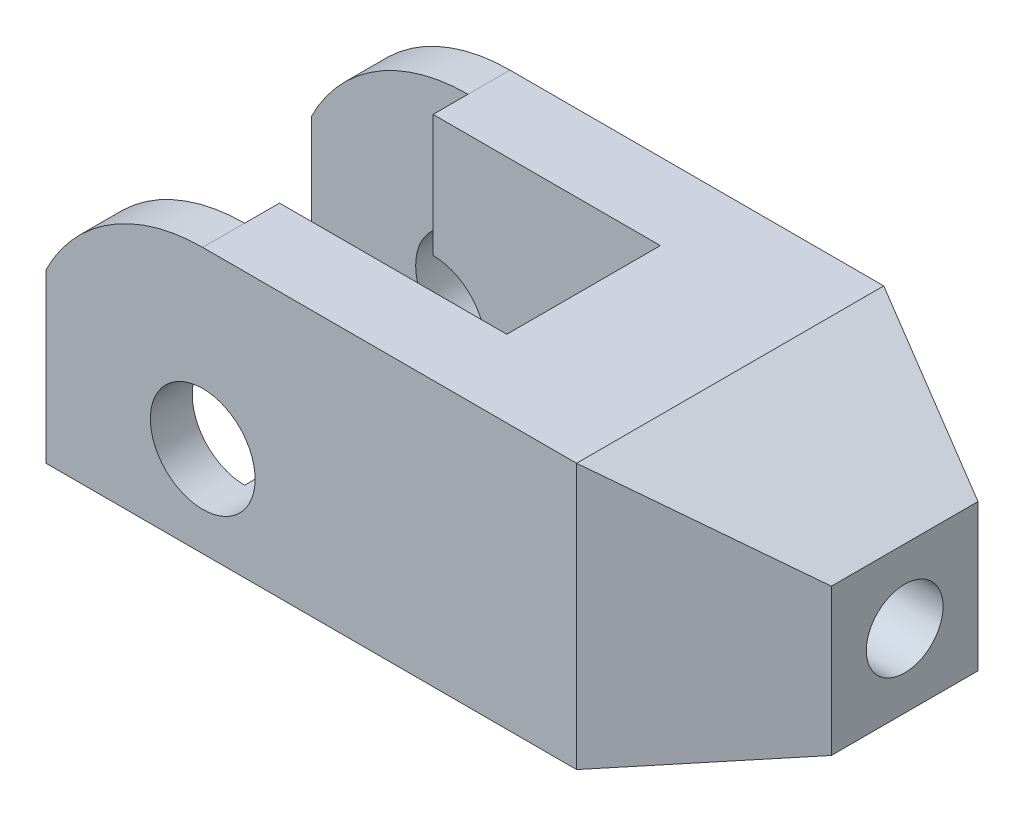
ISO-10303-21;
HEADER;
FILE_DESCRIPTION(('STEP AP214'),'2;1');
FILE_NAME('part.step','',(''),(''),'','','');
FILE_SCHEMA(('AUTOMOTIVE_DESIGN { 1 0 10303 214 1 1 1 1 }'));
ENDSEC;
DATA;
#1=APPLICATION_CONTEXT('core data for automotive mechanical design processes');
#2=APPLICATION_PROTOCOL_DEFINITION('international standard','automotive_design',2000,#1);
#3=PRODUCT_CONTEXT('',#1,'mechanical');
#4=PRODUCT('Part','Part','',(#3));
#5=PRODUCT_RELATED_PRODUCT_CATEGORY('part','',(#4));
#6=PRODUCT_DEFINITION_FORMATION('','',#4);
#7=PRODUCT_DEFINITION_CONTEXT('part definition',#1,'design');
#8=PRODUCT_DEFINITION('design','',#6,#7);
#9=PRODUCT_DEFINITION_SHAPE('','',#8);
#10=(LENGTH_UNIT() NAMED_UNIT(*) SI_UNIT(.MILLI.,.METRE.));
#11=(NAMED_UNIT(*) PLANE_ANGLE_UNIT() SI_UNIT($,.RADIAN.));
#12=(NAMED_UNIT(*) SI_UNIT($,.STERADIAN.) SOLID_ANGLE_UNIT());
#13=UNCERTAINTY_MEASURE_WITH_UNIT(LENGTH_MEASURE(1.E-05),#10,'distance_accuracy_value','');
#14=(GEOMETRIC_REPRESENTATION_CONTEXT(3) GLOBAL_UNCERTAINTY_ASSIGNED_CONTEXT((#13)) GLOBAL_UNIT_ASSIGNED_CONTEXT((#10,
#11,#12)) REPRESENTATION_CONTEXT('',''));
#15=CARTESIAN_POINT('',(0.,0.,0.));
#16=DIRECTION('',(0.,0.,1.));
#17=DIRECTION('',(1.,0.,0.));
#18=AXIS2_PLACEMENT_3D('',#15,#16,#17);
#19=CARTESIAN_POINT('',(0.,0.,22.));
#20=DIRECTION('',(1.,0.,0.));
#21=DIRECTION('',(0.,0.,-1.));
#22=AXIS2_PLACEMENT_3D('',#19,#20,#21);
#23=PLANE('',#22);
#24=DIRECTION('',(0.,-1.,0.));
#25=VECTOR('',#24,1.);
#26=CARTESIAN_POINT('',(0.,38.001,-16.));
#27=LINE('',#26,#25);
#28=CARTESIAN_POINT('',(0.,24.,-16.));
#29=VERTEX_POINT('',#28);
#30=CARTESIAN_POINT('',(0.,0.,-16.));
#31=VERTEX_POINT('',#30);
#32=EDGE_CURVE('E307',#29,#31,#27,.T.);
#33=ORIENTED_EDGE('',*,*,#32,.F.);
#34=DIRECTION('',(0.,0.,1.));
#35=VECTOR('',#34,1.);
#36=CARTESIAN_POINT('',(0.,24.,-22.));
#37=LINE('',#36,#35);
#38=CARTESIAN_POINT('',(0.,24.,-22.));
#39=VERTEX_POINT('',#38);
#40=EDGE_CURVE('E231',#39,#29,#37,.T.);
#41=ORIENTED_EDGE('',*,*,#40,.F.);
#42=DIRECTION('',(0.,-1.,0.));
#43=VECTOR('',#42,1.);
#44=CARTESIAN_POINT('',(0.,0.,-22.));
#45=LINE('',#44,#43);
#46=CARTESIAN_POINT('',(0.,0.,-22.));
#47=VERTEX_POINT('',#46);
#48=EDGE_CURVE('E217',#39,#47,#45,.T.);
#49=ORIENTED_EDGE('',*,*,#48,.T.);
#50=DIRECTION('',(0.,0.,-1.));
#51=VECTOR('',#50,1.);
#52=CARTESIAN_POINT('',(0.,0.,22.));
#53=LINE('',#52,#51);
#54=EDGE_CURVE('E47',#31,#47,#53,.T.);
#55=ORIENTED_EDGE('',*,*,#54,.F.);
#56=EDGE_LOOP('',(#33,#41,#49,#55));
#57=FACE_BOUND('',#56,.T.);
#58=ADVANCED_FACE('F41',(#57),#23,.F.);
#59=CARTESIAN_POINT('',(101.,0.,22.));
#60=DIRECTION('',(-1.,0.,0.));
#61=DIRECTION('',(0.,0.,1.));
#62=AXIS2_PLACEMENT_3D('',#59,#60,#61);
#63=PLANE('',#62);
#64=CARTESIAN_POINT('',(101.,19.,0.));
#65=DIRECTION('',(1.,0.,0.));
#66=DIRECTION('',(0.,0.,-1.));
#67=AXIS2_PLACEMENT_3D('',#64,#65,#66);
#68=CIRCLE('',#67,5.5);
#69=CARTESIAN_POINT('',(101.,19.,-5.5));
#70=VERTEX_POINT('',#69);
#71=EDGE_CURVE('E337',#70,#70,#68,.T.);
#72=ORIENTED_EDGE('',*,*,#71,.F.);
#73=EDGE_LOOP('',(#72));
#74=FACE_BOUND('',#73,.T.);
#75=DIRECTION('',(0.,0.,1.));
#76=VECTOR('',#75,1.);
#77=CARTESIAN_POINT('',(101.,29.5,-22.));
#78=LINE('',#77,#76);
#79=CARTESIAN_POINT('',(101.,29.5,-10.5));
#80=VERTEX_POINT('',#79);
#81=CARTESIAN_POINT('',(101.,29.5,10.5));
#82=VERTEX_POINT('',#81);
#83=EDGE_CURVE('E204',#80,#82,#78,.T.);
#84=ORIENTED_EDGE('',*,*,#83,.T.);
#85=DIRECTION('',(0.,-1.,0.));
#86=VECTOR('',#85,1.);
#87=CARTESIAN_POINT('',(101.,38.001,10.5));
#88=LINE('',#87,#86);
#89=CARTESIAN_POINT('',(101.,8.5,10.5));
#90=VERTEX_POINT('',#89);
#91=EDGE_CURVE('E180',#82,#90,#88,.T.);
#92=ORIENTED_EDGE('',*,*,#91,.T.);
#93=DIRECTION('',(0.,0.,1.));
#94=VECTOR('',#93,1.);
#95=CARTESIAN_POINT('',(101.,8.49999999999999,-22.));
#96=LINE('',#95,#94);
#97=CARTESIAN_POINT('',(101.,8.49999999999999,-10.5));
#98=VERTEX_POINT('',#97);
#99=EDGE_CURVE('E202',#98,#90,#96,.T.);
#100=ORIENTED_EDGE('',*,*,#99,.F.);
#101=DIRECTION('',(0.,-1.,0.));
#102=VECTOR('',#101,1.);
#103=CARTESIAN_POINT('',(101.,38.001,-10.5));
#104=LINE('',#103,#102);
#105=EDGE_CURVE('E57',#80,#98,#104,.T.);
#106=ORIENTED_EDGE('',*,*,#105,.F.);
#107=EDGE_LOOP('',(#84,#92,#100,#106));
#108=FACE_BOUND('',#107,.T.);
#109=ADVANCED_FACE('F350',(#74,#108),#63,.F.);
#110=CARTESIAN_POINT('',(0.,0.,22.));
#111=DIRECTION('',(0.,0.,-1.));
#112=DIRECTION('',(-1.,0.,0.));
#113=AXIS2_PLACEMENT_3D('',#110,#111,#112);
#114=PLANE('',#113);
#115=CARTESIAN_POINT('',(22.4499443206436,13.,22.));
#116=DIRECTION('',(0.,0.,1.));
#117=DIRECTION('',(1.,0.,0.));
#118=AXIS2_PLACEMENT_3D('',#115,#116,#117);
#119=CIRCLE('',#118,7.5);
#120=CARTESIAN_POINT('',(29.9499443206436,13.,22.));
#121=VERTEX_POINT('',#120);
#122=EDGE_CURVE('E238',#121,#121,#119,.T.);
#123=ORIENTED_EDGE('',*,*,#122,.F.);
#124=EDGE_LOOP('',(#123));
#125=FACE_BOUND('',#124,.T.);
#126=DIRECTION('',(0.,-1.,0.));
#127=VECTOR('',#126,1.);
#128=CARTESIAN_POINT('',(76.,38.001,22.));
#129=LINE('',#128,#127);
#130=CARTESIAN_POINT('',(76.,38.,22.));
#131=VERTEX_POINT('',#130);
#132=CARTESIAN_POINT('',(76.,0.,22.));
#133=VERTEX_POINT('',#132);
#134=EDGE_CURVE('E172',#131,#133,#129,.T.);
#135=ORIENTED_EDGE('',*,*,#134,.F.);
#136=DIRECTION('',(-1.,0.,0.));
#137=VECTOR('',#136,1.);
#138=CARTESIAN_POINT('',(0.,38.,22.));
#139=LINE('',#138,#137);
#140=CARTESIAN_POINT('',(22.4499443206436,38.,22.));
#141=VERTEX_POINT('',#140);
#142=EDGE_CURVE('E188',#131,#141,#139,.T.);
#143=ORIENTED_EDGE('',*,*,#142,.T.);
#144=CARTESIAN_POINT('',(22.4499443206436,13.,22.));
#145=DIRECTION('',(0.,0.,-1.));
#146=DIRECTION('',(1.,0.,0.));
#147=AXIS2_PLACEMENT_3D('',#144,#145,#146);
#148=CIRCLE('',#147,25.);
#149=CARTESIAN_POINT('',(0.,24.,22.));
#150=VERTEX_POINT('',#149);
#151=EDGE_CURVE('E228',#150,#141,#148,.T.);
#152=ORIENTED_EDGE('',*,*,#151,.F.);
#153=DIRECTION('',(0.,-1.,0.));
#154=VECTOR('',#153,1.);
#155=CARTESIAN_POINT('',(0.,0.,22.));
#156=LINE('',#155,#154);
#157=CARTESIAN_POINT('',(0.,0.,22.));
#158=VERTEX_POINT('',#157);
#159=EDGE_CURVE('E214',#150,#158,#156,.T.);
#160=ORIENTED_EDGE('',*,*,#159,.T.);
#161=DIRECTION('',(1.,0.,0.));
#162=VECTOR('',#161,1.);
#163=CARTESIAN_POINT('',(0.,0.,22.));
#164=LINE('',#163,#162);
#165=EDGE_CURVE('E194',#158,#133,#164,.T.);
#166=ORIENTED_EDGE('',*,*,#165,.T.);
#167=EDGE_LOOP('',(#135,#143,#152,#160,#166));
#168=FACE_BOUND('',#167,.T.);
#169=ADVANCED_FACE('F190',(#125,#168),#114,.F.);
#170=CARTESIAN_POINT('',(0.,0.,-22.));
#171=DIRECTION('',(0.,0.,-1.));
#172=DIRECTION('',(-1.,0.,0.));
#173=AXIS2_PLACEMENT_3D('',#170,#171,#172);
#174=PLANE('',#173);
#175=CARTESIAN_POINT('',(22.4499443206436,13.,-22.));
#176=DIRECTION('',(0.,0.,1.));
#177=DIRECTION('',(1.,0.,0.));
#178=AXIS2_PLACEMENT_3D('',#175,#176,#177);
#179=CIRCLE('',#178,7.5);
#180=CARTESIAN_POINT('',(29.9499443206436,13.,-22.));
#181=VERTEX_POINT('',#180);
#182=EDGE_CURVE('E226',#181,#181,#179,.T.);
#183=ORIENTED_EDGE('',*,*,#182,.T.);
#184=EDGE_LOOP('',(#183));
#185=FACE_BOUND('',#184,.T.);
#186=DIRECTION('',(-1.,0.,0.));
#187=VECTOR('',#186,1.);
#188=CARTESIAN_POINT('',(0.,38.,-22.));
#189=LINE('',#188,#187);
#190=CARTESIAN_POINT('',(76.,38.,-22.));
#191=VERTEX_POINT('',#190);
#192=CARTESIAN_POINT('',(22.4499443206436,38.,-22.));
#193=VERTEX_POINT('',#192);
#194=EDGE_CURVE('E223',#191,#193,#189,.T.);
#195=ORIENTED_EDGE('',*,*,#194,.F.);
#196=DIRECTION('',(0.,-1.,0.));
#197=VECTOR('',#196,1.);
#198=CARTESIAN_POINT('',(76.,38.001,-22.));
#199=LINE('',#198,#197);
#200=CARTESIAN_POINT('',(76.0000000000001,0.,-22.));
#201=VERTEX_POINT('',#200);
#202=EDGE_CURVE('E247',#191,#201,#199,.T.);
#203=ORIENTED_EDGE('',*,*,#202,.T.);
#204=DIRECTION('',(1.,0.,0.));
#205=VECTOR('',#204,1.);
#206=CARTESIAN_POINT('',(0.,0.,-22.));
#207=LINE('',#206,#205);
#208=EDGE_CURVE('E219',#47,#201,#207,.T.);
#209=ORIENTED_EDGE('',*,*,#208,.F.);
#210=ORIENTED_EDGE('',*,*,#48,.F.);
#211=CARTESIAN_POINT('',(22.4499443206436,13.,-22.));
#212=DIRECTION('',(0.,0.,-1.));
#213=DIRECTION('',(1.,0.,0.));
#214=AXIS2_PLACEMENT_3D('',#211,#212,#213);
#215=CIRCLE('',#214,25.);
#216=EDGE_CURVE('E230',#39,#193,#215,.T.);
#217=ORIENTED_EDGE('',*,*,#216,.T.);
#218=EDGE_LOOP('',(#195,#203,#209,#210,#217));
#219=FACE_BOUND('',#218,.T.);
#220=ADVANCED_FACE('F356',(#185,#219),#174,.T.);
#221=CARTESIAN_POINT('',(22.4499443206436,13.,-22.));
#222=DIRECTION('',(0.,0.,1.));
#223=DIRECTION('',(1.,0.,0.));
#224=AXIS2_PLACEMENT_3D('',#221,#222,#223);
#225=CYLINDRICAL_SURFACE('',#224,7.5);
#226=ORIENTED_EDGE('',*,*,#122,.T.);
#227=EDGE_LOOP('',(#226));
#228=FACE_BOUND('',#227,.T.);
#229=CARTESIAN_POINT('',(22.4499443206436,13.,16.));
#230=DIRECTION('',(0.,0.,-1.));
#231=DIRECTION('',(-1.,0.,0.));
#232=AXIS2_PLACEMENT_3D('',#229,#230,#231);
#233=CIRCLE('',#232,7.5);
#234=CARTESIAN_POINT('',(22.4499443206436,5.5,16.));
#235=VERTEX_POINT('',#234);
#236=CARTESIAN_POINT('',(22.4499443206436,20.5,16.));
#237=VERTEX_POINT('',#236);
#238=EDGE_CURVE('E280',#235,#237,#233,.T.);
#239=ORIENTED_EDGE('',*,*,#238,.T.);
#240=DIRECTION('',(0.,0.,1.));
#241=VECTOR('',#240,1.);
#242=CARTESIAN_POINT('',(22.4499443206436,20.5,-22.));
#243=LINE('',#242,#241);
#244=CARTESIAN_POINT('',(22.4499443206436,20.5,11.));
#245=VERTEX_POINT('',#244);
#246=EDGE_CURVE('E271',#237,#245,#243,.F.);
#247=ORIENTED_EDGE('',*,*,#246,.T.);
#248=CARTESIAN_POINT('',(22.4499443206436,13.,11.));
#249=DIRECTION('',(0.,0.,-1.));
#250=DIRECTION('',(-1.,0.,0.));
#251=AXIS2_PLACEMENT_3D('',#248,#249,#250);
#252=CIRCLE('',#251,7.5);
#253=CARTESIAN_POINT('',(22.4499443206436,5.5,11.));
#254=VERTEX_POINT('',#253);
#255=EDGE_CURVE('E266',#245,#254,#252,.T.);
#256=ORIENTED_EDGE('',*,*,#255,.T.);
#257=DIRECTION('',(0.,0.,1.));
#258=VECTOR('',#257,1.);
#259=CARTESIAN_POINT('',(22.4499443206436,5.5,-22.));
#260=LINE('',#259,#258);
#261=EDGE_CURVE('E278',#254,#235,#260,.T.);
#262=ORIENTED_EDGE('',*,*,#261,.T.);
#263=EDGE_LOOP('',(#239,#247,#256,#262));
#264=FACE_BOUND('',#263,.T.);
#265=ADVANCED_FACE('F401',(#228,#264),#225,.F.);
#266=ORIENTED_EDGE('',*,*,#182,.F.);
#267=EDGE_LOOP('',(#266));
#268=FACE_BOUND('',#267,.T.);
#269=CARTESIAN_POINT('',(22.4499443206436,13.,-11.));
#270=DIRECTION('',(0.,0.,1.));
#271=DIRECTION('',(1.,0.,0.));
#272=AXIS2_PLACEMENT_3D('',#269,#270,#271);
#273=CIRCLE('',#272,7.5);
#274=CARTESIAN_POINT('',(22.4499443206437,5.5,-11.));
#275=VERTEX_POINT('',#274);
#276=CARTESIAN_POINT('',(22.4499443206437,20.5,-11.));
#277=VERTEX_POINT('',#276);
#278=EDGE_CURVE('E269',#275,#277,#273,.T.);
#279=ORIENTED_EDGE('',*,*,#278,.T.);
#280=DIRECTION('',(0.,0.,1.));
#281=VECTOR('',#280,1.);
#282=CARTESIAN_POINT('',(22.4499443206437,20.5,-22.));
#283=LINE('',#282,#281);
#284=CARTESIAN_POINT('',(22.4499443206437,20.5,-16.));
#285=VERTEX_POINT('',#284);
#286=EDGE_CURVE('E262',#277,#285,#283,.F.);
#287=ORIENTED_EDGE('',*,*,#286,.T.);
#288=CARTESIAN_POINT('',(22.4499443206436,13.,-16.));
#289=DIRECTION('',(0.,0.,1.));
#290=DIRECTION('',(1.,0.,0.));
#291=AXIS2_PLACEMENT_3D('',#288,#289,#290);
#292=CIRCLE('',#291,7.5);
#293=CARTESIAN_POINT('',(22.4499443206437,5.5,-16.));
#294=VERTEX_POINT('',#293);
#295=EDGE_CURVE('E332',#285,#294,#292,.T.);
#296=ORIENTED_EDGE('',*,*,#295,.T.);
#297=DIRECTION('',(0.,0.,1.));
#298=VECTOR('',#297,1.);
#299=CARTESIAN_POINT('',(22.4499443206437,5.5,-22.));
#300=LINE('',#299,#298);
#301=EDGE_CURVE('E264',#294,#275,#300,.T.);
#302=ORIENTED_EDGE('',*,*,#301,.T.);
#303=EDGE_LOOP('',(#279,#287,#296,#302));
#304=FACE_BOUND('',#303,.T.);
#305=ADVANCED_FACE('F384',(#268,#304),#225,.F.);
#306=CARTESIAN_POINT('',(22.4499443206436,13.,-22.));
#307=DIRECTION('',(0.,0.,1.));
#308=DIRECTION('',(1.,0.,0.));
#309=AXIS2_PLACEMENT_3D('',#306,#307,#308);
#310=CYLINDRICAL_SURFACE('',#309,25.);
#311=DIRECTION('',(0.,0.,1.));
#312=VECTOR('',#311,1.);
#313=CARTESIAN_POINT('',(22.4499443206436,38.,-22.));
#314=LINE('',#313,#312);
#315=CARTESIAN_POINT('',(22.4499443206436,38.,16.));
#316=VERTEX_POINT('',#315);
#317=EDGE_CURVE('E209',#316,#141,#314,.T.);
#318=ORIENTED_EDGE('',*,*,#317,.F.);
#319=CARTESIAN_POINT('',(22.4499443206436,13.,16.));
#320=DIRECTION('',(0.,0.,-1.));
#321=DIRECTION('',(-1.,0.,0.));
#322=AXIS2_PLACEMENT_3D('',#319,#320,#321);
#323=CIRCLE('',#322,25.);
#324=CARTESIAN_POINT('',(0.,24.,16.));
#325=VERTEX_POINT('',#324);
#326=EDGE_CURVE('E257',#316,#325,#323,.F.);
#327=ORIENTED_EDGE('',*,*,#326,.T.);
#328=EDGE_CURVE('E236',#325,#150,#37,.T.);
#329=ORIENTED_EDGE('',*,*,#328,.T.);
#330=ORIENTED_EDGE('',*,*,#151,.T.);
#331=EDGE_LOOP('',(#318,#327,#329,#330));
#332=FACE_BOUND('',#331,.T.);
#333=ADVANCED_FACE('F413',(#332),#310,.T.);
#334=ORIENTED_EDGE('',*,*,#328,.F.);
#335=DIRECTION('',(0.,-1.,0.));
#336=VECTOR('',#335,1.);
#337=CARTESIAN_POINT('',(0.,38.001,16.));
#338=LINE('',#337,#336);
#339=CARTESIAN_POINT('',(0.,0.,16.));
#340=VERTEX_POINT('',#339);
#341=EDGE_CURVE('E330',#325,#340,#338,.T.);
#342=ORIENTED_EDGE('',*,*,#341,.T.);
#343=EDGE_CURVE('E11',#158,#340,#53,.T.);
#344=ORIENTED_EDGE('',*,*,#343,.F.);
#345=ORIENTED_EDGE('',*,*,#159,.F.);
#346=EDGE_LOOP('',(#334,#342,#344,#345));
#347=FACE_BOUND('',#346,.T.);
#348=ADVANCED_FACE('F43',(#347),#23,.F.);
#349=CARTESIAN_POINT('',(0.,38.,22.));
#350=DIRECTION('',(0.,-1.,0.));
#351=DIRECTION('',(0.,0.,-1.));
#352=AXIS2_PLACEMENT_3D('',#349,#350,#351);
#353=PLANE('',#352);
#354=DIRECTION('',(0.,0.,1.));
#355=VECTOR('',#354,1.);
#356=CARTESIAN_POINT('',(55.,38.,-11.));
#357=LINE('',#356,#355);
#358=CARTESIAN_POINT('',(55.,38.,-11.));
#359=VERTEX_POINT('',#358);
#360=CARTESIAN_POINT('',(55.,38.,11.));
#361=VERTEX_POINT('',#360);
#362=EDGE_CURVE('E281',#359,#361,#357,.T.);
#363=ORIENTED_EDGE('',*,*,#362,.T.);
#364=DIRECTION('',(-1.,0.,0.));
#365=VECTOR('',#364,1.);
#366=CARTESIAN_POINT('',(22.4499443206436,38.,11.));
#367=LINE('',#366,#365);
#368=CARTESIAN_POINT('',(22.4499443206436,38.,11.));
#369=VERTEX_POINT('',#368);
#370=EDGE_CURVE('E289',#361,#369,#367,.T.);
#371=ORIENTED_EDGE('',*,*,#370,.T.);
#372=DIRECTION('',(0.,0.,1.));
#373=VECTOR('',#372,1.);
#374=CARTESIAN_POINT('',(22.4499443206436,38.,-22.));
#375=LINE('',#374,#373);
#376=EDGE_CURVE('E253',#369,#316,#375,.T.);
#377=ORIENTED_EDGE('',*,*,#376,.T.);
#378=ORIENTED_EDGE('',*,*,#317,.T.);
#379=ORIENTED_EDGE('',*,*,#142,.F.);
#380=DIRECTION('',(0.,0.,1.));
#381=VECTOR('',#380,1.);
#382=CARTESIAN_POINT('',(76.,38.,-22.));
#383=LINE('',#382,#381);
#384=EDGE_CURVE('E197',#191,#131,#383,.T.);
#385=ORIENTED_EDGE('',*,*,#384,.F.);
#386=ORIENTED_EDGE('',*,*,#194,.T.);
#387=CARTESIAN_POINT('',(22.4499443206437,38.,-16.));
#388=VERTEX_POINT('',#387);
#389=EDGE_CURVE('E235',#193,#388,#314,.T.);
#390=ORIENTED_EDGE('',*,*,#389,.T.);
#391=CARTESIAN_POINT('',(22.4499443206436,38.,-11.));
#392=VERTEX_POINT('',#391);
#393=EDGE_CURVE('E259',#388,#392,#375,.T.);
#394=ORIENTED_EDGE('',*,*,#393,.T.);
#395=DIRECTION('',(1.,0.,0.));
#396=VECTOR('',#395,1.);
#397=CARTESIAN_POINT('',(22.4499443206436,38.,-11.));
#398=LINE('',#397,#396);
#399=EDGE_CURVE('E285',#392,#359,#398,.T.);
#400=ORIENTED_EDGE('',*,*,#399,.T.);
#401=EDGE_LOOP('',(#363,#371,#377,#378,#379,#385,#386,#390,#394,#400));
#402=FACE_BOUND('',#401,.T.);
#403=ADVANCED_FACE('F207',(#402),#353,.F.);
#404=CARTESIAN_POINT('',(0.,0.,22.));
#405=DIRECTION('',(0.,1.,0.));
#406=DIRECTION('',(0.,0.,1.));
#407=AXIS2_PLACEMENT_3D('',#404,#405,#406);
#408=PLANE('',#407);
#409=DIRECTION('',(0.,0.,-1.));
#410=VECTOR('',#409,1.);
#411=CARTESIAN_POINT('',(22.4499443206437,0.,-16.));
#412=LINE('',#411,#410);
#413=CARTESIAN_POINT('',(22.4499443206436,0.,-11.));
#414=VERTEX_POINT('',#413);
#415=CARTESIAN_POINT('',(22.4499443206437,0.,-16.));
#416=VERTEX_POINT('',#415);
#417=EDGE_CURVE('E304',#414,#416,#412,.T.);
#418=ORIENTED_EDGE('',*,*,#417,.T.);
#419=DIRECTION('',(-1.,0.,0.));
#420=VECTOR('',#419,1.);
#421=CARTESIAN_POINT('',(0.,0.,-16.));
#422=LINE('',#421,#420);
#423=EDGE_CURVE('E65',#416,#31,#422,.T.);
#424=ORIENTED_EDGE('',*,*,#423,.T.);
#425=ORIENTED_EDGE('',*,*,#54,.T.);
#426=ORIENTED_EDGE('',*,*,#208,.T.);
#427=DIRECTION('',(0.,0.,1.));
#428=VECTOR('',#427,1.);
#429=CARTESIAN_POINT('',(76.,0.,-22.));
#430=LINE('',#429,#428);
#431=EDGE_CURVE('E241',#201,#133,#430,.T.);
#432=ORIENTED_EDGE('',*,*,#431,.T.);
#433=ORIENTED_EDGE('',*,*,#165,.F.);
#434=ORIENTED_EDGE('',*,*,#343,.T.);
#435=DIRECTION('',(1.,0.,0.));
#436=VECTOR('',#435,1.);
#437=CARTESIAN_POINT('',(0.,0.,16.));
#438=LINE('',#437,#436);
#439=CARTESIAN_POINT('',(22.4499443206437,0.,16.));
#440=VERTEX_POINT('',#439);
#441=EDGE_CURVE('E286',#340,#440,#438,.T.);
#442=ORIENTED_EDGE('',*,*,#441,.T.);
#443=DIRECTION('',(0.,0.,-1.));
#444=VECTOR('',#443,1.);
#445=CARTESIAN_POINT('',(22.4499443206437,0.,16.));
#446=LINE('',#445,#444);
#447=CARTESIAN_POINT('',(22.4499443206436,0.,11.));
#448=VERTEX_POINT('',#447);
#449=EDGE_CURVE('E291',#440,#448,#446,.T.);
#450=ORIENTED_EDGE('',*,*,#449,.T.);
#451=DIRECTION('',(1.,0.,0.));
#452=VECTOR('',#451,1.);
#453=CARTESIAN_POINT('',(22.4499443206436,0.,11.));
#454=LINE('',#453,#452);
#455=CARTESIAN_POINT('',(55.,0.,11.));
#456=VERTEX_POINT('',#455);
#457=EDGE_CURVE('E298',#448,#456,#454,.T.);
#458=ORIENTED_EDGE('',*,*,#457,.T.);
#459=DIRECTION('',(0.,0.,-1.));
#460=VECTOR('',#459,1.);
#461=CARTESIAN_POINT('',(55.,0.,-11.));
#462=LINE('',#461,#460);
#463=CARTESIAN_POINT('',(55.,0.,-11.));
#464=VERTEX_POINT('',#463);
#465=EDGE_CURVE('E299',#456,#464,#462,.T.);
#466=ORIENTED_EDGE('',*,*,#465,.T.);
#467=DIRECTION('',(-1.,0.,0.));
#468=VECTOR('',#467,1.);
#469=CARTESIAN_POINT('',(22.4499443206436,0.,-11.));
#470=LINE('',#469,#468);
#471=EDGE_CURVE('E305',#464,#414,#470,.T.);
#472=ORIENTED_EDGE('',*,*,#471,.T.);
#473=EDGE_LOOP('',(#418,#424,#425,#426,#432,#433,#434,#442,#450,#458,#466,#472));
#474=FACE_BOUND('',#473,.T.);
#475=ADVANCED_FACE('F367',(#474),#408,.F.);
#476=CARTESIAN_POINT('',(76.,38.,-22.));
#477=DIRECTION('',(-0.321902733238702,-0.946772744819713,0.));
#478=DIRECTION('',(0.946772744819713,-0.321902733238702,0.));
#479=AXIS2_PLACEMENT_3D('',#476,#477,#478);
#480=PLANE('',#479);
#481=ORIENTED_EDGE('',*,*,#384,.T.);
#482=DIRECTION('',(0.868024160573518,-0.295128214594996,-0.399291113863818));
#483=VECTOR('',#482,1.);
#484=CARTESIAN_POINT('',(75.9997438215793,38.0000871006631,22.0001178420735));
#485=LINE('',#484,#483);
#486=EDGE_CURVE('E171',#131,#82,#485,.T.);
#487=ORIENTED_EDGE('',*,*,#486,.T.);
#488=ORIENTED_EDGE('',*,*,#83,.F.);
#489=DIRECTION('',(-0.868024160573518,0.295128214594996,-0.399291113863818));
#490=VECTOR('',#489,1.);
#491=CARTESIAN_POINT('',(75.9997438215793,38.0000871006631,-22.0001178420735));
#492=LINE('',#491,#490);
#493=EDGE_CURVE('E198',#80,#191,#492,.T.);
#494=ORIENTED_EDGE('',*,*,#493,.T.);
#495=EDGE_LOOP('',(#481,#487,#488,#494));
#496=FACE_BOUND('',#495,.T.);
#497=ADVANCED_FACE('F200',(#496),#480,.F.);
#498=CARTESIAN_POINT('',(76.,0.,-22.));
#499=DIRECTION('',(-0.321902733238702,0.946772744819713,0.));
#500=DIRECTION('',(-0.946772744819713,-0.321902733238702,0.));
#501=AXIS2_PLACEMENT_3D('',#498,#499,#500);
#502=PLANE('',#501);
#503=ORIENTED_EDGE('',*,*,#99,.T.);
#504=DIRECTION('',(-0.868024160573518,-0.295128214594996,0.399291113863818));
#505=VECTOR('',#504,1.);
#506=CARTESIAN_POINT('',(85.7350361663653,3.3099122965642,17.521883363472));
#507=LINE('',#506,#505);
#508=EDGE_CURVE('E185',#90,#133,#507,.T.);
#509=ORIENTED_EDGE('',*,*,#508,.T.);
#510=ORIENTED_EDGE('',*,*,#431,.F.);
#511=DIRECTION('',(0.868024160573518,0.295128214594996,0.399291113863818));
#512=VECTOR('',#511,1.);
#513=CARTESIAN_POINT('',(85.7350361663653,3.3099122965642,-17.521883363472));
#514=LINE('',#513,#512);
#515=EDGE_CURVE('E254',#201,#98,#514,.T.);
#516=ORIENTED_EDGE('',*,*,#515,.T.);
#517=EDGE_LOOP('',(#503,#509,#510,#516));
#518=FACE_BOUND('',#517,.T.);
#519=ADVANCED_FACE('F352',(#518),#502,.F.);
#520=ORIENTED_EDGE('',*,*,#40,.T.);
#521=CARTESIAN_POINT('',(22.4499443206436,13.,-16.));
#522=DIRECTION('',(0.,0.,1.));
#523=DIRECTION('',(1.,0.,0.));
#524=AXIS2_PLACEMENT_3D('',#521,#522,#523);
#525=CIRCLE('',#524,25.);
#526=EDGE_CURVE('E326',#29,#388,#525,.F.);
#527=ORIENTED_EDGE('',*,*,#526,.T.);
#528=ORIENTED_EDGE('',*,*,#389,.F.);
#529=ORIENTED_EDGE('',*,*,#216,.F.);
#530=EDGE_LOOP('',(#520,#527,#528,#529));
#531=FACE_BOUND('',#530,.T.);
#532=ADVANCED_FACE('F365',(#531),#310,.T.);
#533=CARTESIAN_POINT('',(0.,38.001,16.));
#534=DIRECTION('',(0.,0.,-1.));
#535=DIRECTION('',(-1.,0.,0.));
#536=AXIS2_PLACEMENT_3D('',#533,#534,#535);
#537=PLANE('',#536);
#538=DIRECTION('',(0.,-1.,0.));
#539=VECTOR('',#538,1.);
#540=CARTESIAN_POINT('',(22.4499443206437,38.001,16.));
#541=LINE('',#540,#539);
#542=EDGE_CURVE('E325',#235,#440,#541,.T.);
#543=ORIENTED_EDGE('',*,*,#542,.T.);
#544=ORIENTED_EDGE('',*,*,#441,.F.);
#545=ORIENTED_EDGE('',*,*,#341,.F.);
#546=ORIENTED_EDGE('',*,*,#326,.F.);
#547=EDGE_CURVE('E327',#316,#237,#541,.T.);
#548=ORIENTED_EDGE('',*,*,#547,.T.);
#549=ORIENTED_EDGE('',*,*,#238,.F.);
#550=EDGE_LOOP('',(#543,#544,#545,#546,#548,#549));
#551=FACE_BOUND('',#550,.T.);
#552=ADVANCED_FACE('F408',(#551),#537,.T.);
#553=CARTESIAN_POINT('',(22.4499443206437,38.001,16.));
#554=DIRECTION('',(-1.,0.,0.));
#555=DIRECTION('',(0.,0.,1.));
#556=AXIS2_PLACEMENT_3D('',#553,#554,#555);
#557=PLANE('',#556);
#558=DIRECTION('',(0.,-1.,0.));
#559=VECTOR('',#558,1.);
#560=CARTESIAN_POINT('',(22.4499443206436,38.001,11.));
#561=LINE('',#560,#559);
#562=EDGE_CURVE('E323',#254,#448,#561,.T.);
#563=ORIENTED_EDGE('',*,*,#562,.T.);
#564=ORIENTED_EDGE('',*,*,#449,.F.);
#565=ORIENTED_EDGE('',*,*,#542,.F.);
#566=ORIENTED_EDGE('',*,*,#261,.F.);
#567=EDGE_LOOP('',(#563,#564,#565,#566));
#568=FACE_BOUND('',#567,.T.);
#569=ADVANCED_FACE('F407',(#568),#557,.T.);
#570=ORIENTED_EDGE('',*,*,#547,.F.);
#571=ORIENTED_EDGE('',*,*,#376,.F.);
#572=EDGE_CURVE('E322',#369,#245,#561,.T.);
#573=ORIENTED_EDGE('',*,*,#572,.T.);
#574=ORIENTED_EDGE('',*,*,#246,.F.);
#575=EDGE_LOOP('',(#570,#571,#573,#574));
#576=FACE_BOUND('',#575,.T.);
#577=ADVANCED_FACE('F396',(#576),#557,.T.);
#578=CARTESIAN_POINT('',(22.4499443206436,38.001,11.));
#579=DIRECTION('',(0.,0.,-1.));
#580=DIRECTION('',(-1.,0.,0.));
#581=AXIS2_PLACEMENT_3D('',#578,#579,#580);
#582=PLANE('',#581);
#583=DIRECTION('',(0.,-1.,0.));
#584=VECTOR('',#583,1.);
#585=CARTESIAN_POINT('',(55.,38.001,11.));
#586=LINE('',#585,#584);
#587=EDGE_CURVE('E316',#361,#456,#586,.T.);
#588=ORIENTED_EDGE('',*,*,#587,.T.);
#589=ORIENTED_EDGE('',*,*,#457,.F.);
#590=ORIENTED_EDGE('',*,*,#562,.F.);
#591=ORIENTED_EDGE('',*,*,#255,.F.);
#592=ORIENTED_EDGE('',*,*,#572,.F.);
#593=ORIENTED_EDGE('',*,*,#370,.F.);
#594=EDGE_LOOP('',(#588,#589,#590,#591,#592,#593));
#595=FACE_BOUND('',#594,.T.);
#596=ADVANCED_FACE('F394',(#595),#582,.T.);
#597=CARTESIAN_POINT('',(55.,38.001,-11.));
#598=DIRECTION('',(-1.,0.,0.));
#599=DIRECTION('',(0.,0.,1.));
#600=AXIS2_PLACEMENT_3D('',#597,#598,#599);
#601=PLANE('',#600);
#602=CARTESIAN_POINT('',(55.,19.,0.));
#603=DIRECTION('',(-1.,0.,0.));
#604=DIRECTION('',(0.,0.,1.));
#605=AXIS2_PLACEMENT_3D('',#602,#603,#604);
#606=CIRCLE('',#605,5.5);
#607=CARTESIAN_POINT('',(55.,19.,5.5));
#608=VERTEX_POINT('',#607);
#609=EDGE_CURVE('E339',#608,#608,#606,.F.);
#610=ORIENTED_EDGE('',*,*,#609,.T.);
#611=EDGE_LOOP('',(#610));
#612=FACE_BOUND('',#611,.T.);
#613=DIRECTION('',(0.,-1.,0.));
#614=VECTOR('',#613,1.);
#615=CARTESIAN_POINT('',(55.,38.001,-11.));
#616=LINE('',#615,#614);
#617=EDGE_CURVE('E320',#359,#464,#616,.T.);
#618=ORIENTED_EDGE('',*,*,#617,.T.);
#619=ORIENTED_EDGE('',*,*,#465,.F.);
#620=ORIENTED_EDGE('',*,*,#587,.F.);
#621=ORIENTED_EDGE('',*,*,#362,.F.);
#622=EDGE_LOOP('',(#618,#619,#620,#621));
#623=FACE_BOUND('',#622,.T.);
#624=ADVANCED_FACE('F390',(#612,#623),#601,.T.);
#625=CARTESIAN_POINT('',(22.4499443206436,38.001,-11.));
#626=DIRECTION('',(0.,0.,1.));
#627=DIRECTION('',(1.,0.,0.));
#628=AXIS2_PLACEMENT_3D('',#625,#626,#627);
#629=PLANE('',#628);
#630=DIRECTION('',(0.,-1.,0.));
#631=VECTOR('',#630,1.);
#632=CARTESIAN_POINT('',(22.4499443206436,38.001,-11.));
#633=LINE('',#632,#631);
#634=EDGE_CURVE('E317',#392,#277,#633,.T.);
#635=ORIENTED_EDGE('',*,*,#634,.T.);
#636=ORIENTED_EDGE('',*,*,#278,.F.);
#637=EDGE_CURVE('E313',#275,#414,#633,.T.);
#638=ORIENTED_EDGE('',*,*,#637,.T.);
#639=ORIENTED_EDGE('',*,*,#471,.F.);
#640=ORIENTED_EDGE('',*,*,#617,.F.);
#641=ORIENTED_EDGE('',*,*,#399,.F.);
#642=EDGE_LOOP('',(#635,#636,#638,#639,#640,#641));
#643=FACE_BOUND('',#642,.T.);
#644=ADVANCED_FACE('F383',(#643),#629,.T.);
#645=CARTESIAN_POINT('',(22.4499443206437,38.001,-16.));
#646=DIRECTION('',(-1.,0.,0.));
#647=DIRECTION('',(0.,0.,1.));
#648=AXIS2_PLACEMENT_3D('',#645,#646,#647);
#649=PLANE('',#648);
#650=DIRECTION('',(0.,-1.,0.));
#651=VECTOR('',#650,1.);
#652=CARTESIAN_POINT('',(22.4499443206437,38.001,-16.));
#653=LINE('',#652,#651);
#654=EDGE_CURVE('E311',#294,#416,#653,.T.);
#655=ORIENTED_EDGE('',*,*,#654,.T.);
#656=ORIENTED_EDGE('',*,*,#417,.F.);
#657=ORIENTED_EDGE('',*,*,#637,.F.);
#658=ORIENTED_EDGE('',*,*,#301,.F.);
#659=EDGE_LOOP('',(#655,#656,#657,#658));
#660=FACE_BOUND('',#659,.T.);
#661=ADVANCED_FACE('F372',(#660),#649,.T.);
#662=ORIENTED_EDGE('',*,*,#634,.F.);
#663=ORIENTED_EDGE('',*,*,#393,.F.);
#664=EDGE_CURVE('E312',#388,#285,#653,.T.);
#665=ORIENTED_EDGE('',*,*,#664,.T.);
#666=ORIENTED_EDGE('',*,*,#286,.F.);
#667=EDGE_LOOP('',(#662,#663,#665,#666));
#668=FACE_BOUND('',#667,.T.);
#669=ADVANCED_FACE('F379',(#668),#649,.T.);
#670=CARTESIAN_POINT('',(0.,38.001,-16.));
#671=DIRECTION('',(0.,0.,1.));
#672=DIRECTION('',(1.,0.,0.));
#673=AXIS2_PLACEMENT_3D('',#670,#671,#672);
#674=PLANE('',#673);
#675=ORIENTED_EDGE('',*,*,#664,.F.);
#676=ORIENTED_EDGE('',*,*,#526,.F.);
#677=ORIENTED_EDGE('',*,*,#32,.T.);
#678=ORIENTED_EDGE('',*,*,#423,.F.);
#679=ORIENTED_EDGE('',*,*,#654,.F.);
#680=ORIENTED_EDGE('',*,*,#295,.F.);
#681=EDGE_LOOP('',(#675,#676,#677,#678,#679,#680));
#682=FACE_BOUND('',#681,.T.);
#683=ADVANCED_FACE('F370',(#682),#674,.T.);
#684=CARTESIAN_POINT('',(76.,38.001,-22.));
#685=DIRECTION('',(0.417905608232144,0.,-0.908490452678575));
#686=DIRECTION('',(-0.908490452678575,0.,-0.417905608232144));
#687=AXIS2_PLACEMENT_3D('',#684,#685,#686);
#688=PLANE('',#687);
#689=ORIENTED_EDGE('',*,*,#105,.T.);
#690=ORIENTED_EDGE('',*,*,#515,.F.);
#691=ORIENTED_EDGE('',*,*,#202,.F.);
#692=ORIENTED_EDGE('',*,*,#493,.F.);
#693=EDGE_LOOP('',(#689,#690,#691,#692));
#694=FACE_BOUND('',#693,.T.);
#695=ADVANCED_FACE('F351',(#694),#688,.T.);
#696=CARTESIAN_POINT('',(76.,38.001,22.));
#697=DIRECTION('',(0.417905608232144,0.,0.908490452678575));
#698=DIRECTION('',(0.908490452678575,0.,-0.417905608232144));
#699=AXIS2_PLACEMENT_3D('',#696,#697,#698);
#700=PLANE('',#699);
#701=ORIENTED_EDGE('',*,*,#134,.T.);
#702=ORIENTED_EDGE('',*,*,#508,.F.);
#703=ORIENTED_EDGE('',*,*,#91,.F.);
#704=ORIENTED_EDGE('',*,*,#486,.F.);
#705=EDGE_LOOP('',(#701,#702,#703,#704));
#706=FACE_BOUND('',#705,.T.);
#707=ADVANCED_FACE('F173',(#706),#700,.T.);
#708=CARTESIAN_POINT('',(-0.001000000000001,19.,0.));
#709=DIRECTION('',(1.,0.,0.));
#710=DIRECTION('',(0.,0.,-1.));
#711=AXIS2_PLACEMENT_3D('',#708,#709,#710);
#712=CYLINDRICAL_SURFACE('',#711,5.5);
#713=ORIENTED_EDGE('',*,*,#609,.F.);
#714=EDGE_LOOP('',(#713));
#715=FACE_BOUND('',#714,.T.);
#716=ORIENTED_EDGE('',*,*,#71,.T.);
#717=EDGE_LOOP('',(#716));
#718=FACE_BOUND('',#717,.T.);
#719=ADVANCED_FACE('F341',(#715,#718),#712,.F.);
#720=CLOSED_SHELL('',(#58,#109,#169,#220,#265,#305,#333,#348,#403,#475,#497,#519,#532,#552,#569,
#577,#596,#624,#644,#661,#669,#683,#695,#707,#719));
#721=MANIFOLD_SOLID_BREP('B2',#720);
#722=ADVANCED_BREP_SHAPE_REPRESENTATION('',(#18,#721),#14);
#723=SHAPE_DEFINITION_REPRESENTATION(#9,#722);
ENDSEC;
END-ISO-10303-21;
